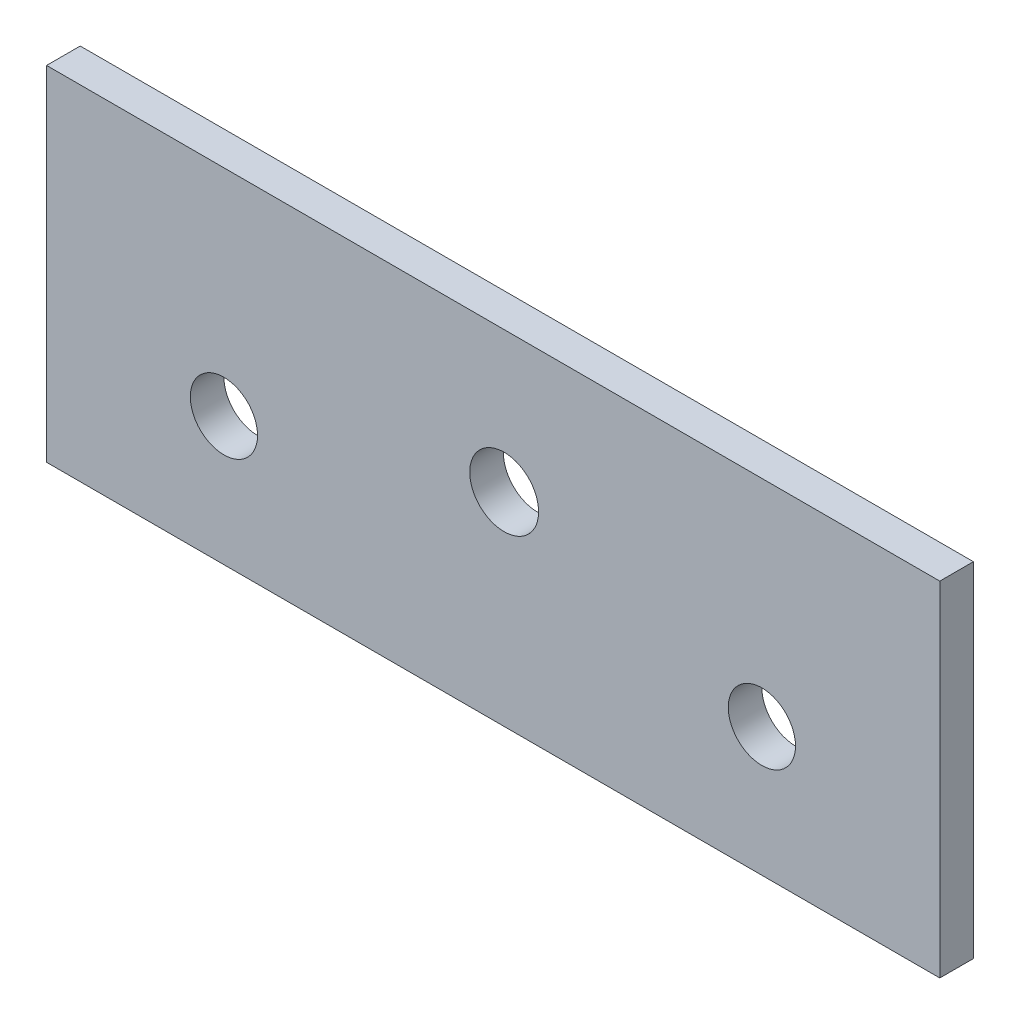
ISO-10303-21;
HEADER;
FILE_DESCRIPTION(('STEP AP214'),'2;1');
FILE_NAME('part.step','',(''),(''),'','','');
FILE_SCHEMA(('AUTOMOTIVE_DESIGN { 1 0 10303 214 1 1 1 1 }'));
ENDSEC;
DATA;
#1=APPLICATION_CONTEXT('core data for automotive mechanical design processes');
#2=APPLICATION_PROTOCOL_DEFINITION('international standard','automotive_design',2000,#1);
#3=PRODUCT_CONTEXT('',#1,'mechanical');
#4=PRODUCT('Part','Part','',(#3));
#5=PRODUCT_RELATED_PRODUCT_CATEGORY('part','',(#4));
#6=PRODUCT_DEFINITION_FORMATION('','',#4);
#7=PRODUCT_DEFINITION_CONTEXT('part definition',#1,'design');
#8=PRODUCT_DEFINITION('design','',#6,#7);
#9=PRODUCT_DEFINITION_SHAPE('','',#8);
#10=(LENGTH_UNIT() NAMED_UNIT(*) SI_UNIT(.MILLI.,.METRE.));
#11=(NAMED_UNIT(*) PLANE_ANGLE_UNIT() SI_UNIT($,.RADIAN.));
#12=(NAMED_UNIT(*) SI_UNIT($,.STERADIAN.) SOLID_ANGLE_UNIT());
#13=UNCERTAINTY_MEASURE_WITH_UNIT(LENGTH_MEASURE(1.E-05),#10,'distance_accuracy_value','');
#14=(GEOMETRIC_REPRESENTATION_CONTEXT(3) GLOBAL_UNCERTAINTY_ASSIGNED_CONTEXT((#13)) GLOBAL_UNIT_ASSIGNED_CONTEXT((#10,
#11,#12)) REPRESENTATION_CONTEXT('',''));
#15=CARTESIAN_POINT('',(0.,0.,0.));
#16=DIRECTION('',(0.,0.,1.));
#17=DIRECTION('',(1.,0.,0.));
#18=AXIS2_PLACEMENT_3D('',#15,#16,#17);
#19=CARTESIAN_POINT('',(0.,0.,3.175));
#20=DIRECTION('',(0.,0.,1.));
#21=DIRECTION('',(1.,0.,0.));
#22=AXIS2_PLACEMENT_3D('',#19,#20,#21);
#23=PLANE('',#22);
#24=CARTESIAN_POINT('',(76.2000000000006,-176.892857142857,3.175));
#25=DIRECTION('',(0.,0.,1.));
#26=DIRECTION('',(1.,0.,0.));
#27=AXIS2_PLACEMENT_3D('',#24,#25,#26);
#28=CIRCLE('',#27,3.17499999999998);
#29=CARTESIAN_POINT('',(79.3750000000006,-176.892857142857,3.175));
#30=VERTEX_POINT('',#29);
#31=EDGE_CURVE('E121',#30,#30,#28,.T.);
#32=ORIENTED_EDGE('',*,*,#31,.F.);
#33=EDGE_LOOP('',(#32));
#34=FACE_BOUND('',#33,.T.);
#35=DIRECTION('',(0.,-1.,0.));
#36=VECTOR('',#35,1.);
#37=CARTESIAN_POINT('',(8.65511732176216,-156.589142015321,3.175));
#38=LINE('',#37,#36);
#39=CARTESIAN_POINT('',(8.65511732176216,-156.589142015321,3.175));
#40=VERTEX_POINT('',#39);
#41=CARTESIAN_POINT('',(8.65511732176216,-189.047286789418,3.175));
#42=VERTEX_POINT('',#41);
#43=EDGE_CURVE('E91',#40,#42,#38,.T.);
#44=ORIENTED_EDGE('',*,*,#43,.T.);
#45=DIRECTION('',(1.,0.,0.));
#46=VECTOR('',#45,1.);
#47=CARTESIAN_POINT('',(8.65511732176216,-189.047286789418,3.175));
#48=LINE('',#47,#46);
#49=CARTESIAN_POINT('',(92.999147290957,-189.047286789418,3.175));
#50=VERTEX_POINT('',#49);
#51=EDGE_CURVE('E86',#42,#50,#48,.T.);
#52=ORIENTED_EDGE('',*,*,#51,.T.);
#53=DIRECTION('',(0.,1.,0.));
#54=VECTOR('',#53,1.);
#55=CARTESIAN_POINT('',(92.999147290957,-156.589142015321,3.175));
#56=LINE('',#55,#54);
#57=CARTESIAN_POINT('',(92.999147290957,-156.589142015321,3.175));
#58=VERTEX_POINT('',#57);
#59=EDGE_CURVE('E89',#50,#58,#56,.T.);
#60=ORIENTED_EDGE('',*,*,#59,.T.);
#61=DIRECTION('',(-1.,0.,0.));
#62=VECTOR('',#61,1.);
#63=CARTESIAN_POINT('',(8.65511732176216,-156.589142015321,3.175));
#64=LINE('',#63,#62);
#65=EDGE_CURVE('E56',#58,#40,#64,.T.);
#66=ORIENTED_EDGE('',*,*,#65,.T.);
#67=EDGE_LOOP('',(#44,#52,#60,#66));
#68=FACE_BOUND('',#67,.T.);
#69=CARTESIAN_POINT('',(25.4000000000006,-176.892857142857,3.175));
#70=DIRECTION('',(0.,0.,1.));
#71=DIRECTION('',(1.,0.,0.));
#72=AXIS2_PLACEMENT_3D('',#69,#70,#71);
#73=CIRCLE('',#72,3.17500000000001);
#74=CARTESIAN_POINT('',(28.5750000000006,-176.892857142857,3.175));
#75=VERTEX_POINT('',#74);
#76=EDGE_CURVE('E106',#75,#75,#73,.T.);
#77=ORIENTED_EDGE('',*,*,#76,.F.);
#78=EDGE_LOOP('',(#77));
#79=FACE_BOUND('',#78,.T.);
#80=CARTESIAN_POINT('',(51.8620466073178,-169.868155983452,3.175));
#81=DIRECTION('',(0.,0.,1.));
#82=DIRECTION('',(1.,0.,0.));
#83=AXIS2_PLACEMENT_3D('',#80,#81,#82);
#84=CIRCLE('',#83,3.2512);
#85=CARTESIAN_POINT('',(55.1132466073178,-169.868155983452,3.175));
#86=VERTEX_POINT('',#85);
#87=EDGE_CURVE('E127',#86,#86,#84,.T.);
#88=ORIENTED_EDGE('',*,*,#87,.F.);
#89=EDGE_LOOP('',(#88));
#90=FACE_BOUND('',#89,.T.);
#91=ADVANCED_FACE('F39',(#34,#68,#79,#90),#23,.T.);
#92=CARTESIAN_POINT('',(0.,0.,0.));
#93=DIRECTION('',(0.,0.,1.));
#94=DIRECTION('',(1.,0.,0.));
#95=AXIS2_PLACEMENT_3D('',#92,#93,#94);
#96=PLANE('',#95);
#97=DIRECTION('',(0.,-1.,0.));
#98=VECTOR('',#97,1.);
#99=CARTESIAN_POINT('',(8.65511732176216,-156.589142015321,0.));
#100=LINE('',#99,#98);
#101=CARTESIAN_POINT('',(8.65511732176216,-156.589142015321,0.));
#102=VERTEX_POINT('',#101);
#103=CARTESIAN_POINT('',(8.65511732176216,-189.047286789418,0.));
#104=VERTEX_POINT('',#103);
#105=EDGE_CURVE('E103',#102,#104,#100,.T.);
#106=ORIENTED_EDGE('',*,*,#105,.F.);
#107=DIRECTION('',(-1.,0.,0.));
#108=VECTOR('',#107,1.);
#109=CARTESIAN_POINT('',(8.65511732176216,-156.589142015321,0.));
#110=LINE('',#109,#108);
#111=CARTESIAN_POINT('',(92.999147290957,-156.589142015321,0.));
#112=VERTEX_POINT('',#111);
#113=EDGE_CURVE('E79',#112,#102,#110,.T.);
#114=ORIENTED_EDGE('',*,*,#113,.F.);
#115=DIRECTION('',(0.,1.,0.));
#116=VECTOR('',#115,1.);
#117=CARTESIAN_POINT('',(92.999147290957,-156.589142015321,0.));
#118=LINE('',#117,#116);
#119=CARTESIAN_POINT('',(92.999147290957,-189.047286789418,0.));
#120=VERTEX_POINT('',#119);
#121=EDGE_CURVE('E73',#120,#112,#118,.T.);
#122=ORIENTED_EDGE('',*,*,#121,.F.);
#123=DIRECTION('',(1.,0.,0.));
#124=VECTOR('',#123,1.);
#125=CARTESIAN_POINT('',(8.65511732176216,-189.047286789418,0.));
#126=LINE('',#125,#124);
#127=EDGE_CURVE('E95',#104,#120,#126,.T.);
#128=ORIENTED_EDGE('',*,*,#127,.F.);
#129=EDGE_LOOP('',(#106,#114,#122,#128));
#130=FACE_BOUND('',#129,.T.);
#131=CARTESIAN_POINT('',(25.4000000000006,-176.892857142857,0.));
#132=DIRECTION('',(0.,0.,1.));
#133=DIRECTION('',(1.,0.,0.));
#134=AXIS2_PLACEMENT_3D('',#131,#132,#133);
#135=CIRCLE('',#134,3.17500000000001);
#136=CARTESIAN_POINT('',(28.5750000000006,-176.892857142857,0.));
#137=VERTEX_POINT('',#136);
#138=EDGE_CURVE('E118',#137,#137,#135,.T.);
#139=ORIENTED_EDGE('',*,*,#138,.T.);
#140=EDGE_LOOP('',(#139));
#141=FACE_BOUND('',#140,.T.);
#142=CARTESIAN_POINT('',(76.2000000000006,-176.892857142857,0.));
#143=DIRECTION('',(0.,0.,1.));
#144=DIRECTION('',(1.,0.,0.));
#145=AXIS2_PLACEMENT_3D('',#142,#143,#144);
#146=CIRCLE('',#145,3.17499999999998);
#147=CARTESIAN_POINT('',(79.3750000000006,-176.892857142857,0.));
#148=VERTEX_POINT('',#147);
#149=EDGE_CURVE('E124',#148,#148,#146,.T.);
#150=ORIENTED_EDGE('',*,*,#149,.T.);
#151=EDGE_LOOP('',(#150));
#152=FACE_BOUND('',#151,.T.);
#153=CARTESIAN_POINT('',(51.8620466073178,-169.868155983452,0.));
#154=DIRECTION('',(0.,0.,1.));
#155=DIRECTION('',(1.,0.,0.));
#156=AXIS2_PLACEMENT_3D('',#153,#154,#155);
#157=CIRCLE('',#156,3.2512);
#158=CARTESIAN_POINT('',(55.1132466073178,-169.868155983452,0.));
#159=VERTEX_POINT('',#158);
#160=EDGE_CURVE('E130',#159,#159,#157,.T.);
#161=ORIENTED_EDGE('',*,*,#160,.T.);
#162=EDGE_LOOP('',(#161));
#163=FACE_BOUND('',#162,.T.);
#164=ADVANCED_FACE('F114',(#130,#141,#152,#163),#96,.F.);
#165=CARTESIAN_POINT('',(8.65511732176216,-156.589142015321,3.175));
#166=DIRECTION('',(1.,0.,0.));
#167=DIRECTION('',(0.,0.,-1.));
#168=AXIS2_PLACEMENT_3D('',#165,#166,#167);
#169=PLANE('',#168);
#170=ORIENTED_EDGE('',*,*,#105,.T.);
#171=DIRECTION('',(0.,0.,-1.));
#172=VECTOR('',#171,1.);
#173=CARTESIAN_POINT('',(8.65511732176216,-189.047286789418,3.175));
#174=LINE('',#173,#172);
#175=EDGE_CURVE('E11',#42,#104,#174,.T.);
#176=ORIENTED_EDGE('',*,*,#175,.F.);
#177=ORIENTED_EDGE('',*,*,#43,.F.);
#178=DIRECTION('',(0.,0.,-1.));
#179=VECTOR('',#178,1.);
#180=CARTESIAN_POINT('',(8.65511732176216,-156.589142015321,3.175));
#181=LINE('',#180,#179);
#182=EDGE_CURVE('E99',#40,#102,#181,.T.);
#183=ORIENTED_EDGE('',*,*,#182,.T.);
#184=EDGE_LOOP('',(#170,#176,#177,#183));
#185=FACE_BOUND('',#184,.T.);
#186=ADVANCED_FACE('F41',(#185),#169,.F.);
#187=CARTESIAN_POINT('',(8.65511732176216,-189.047286789418,3.175));
#188=DIRECTION('',(0.,1.,0.));
#189=DIRECTION('',(0.,0.,1.));
#190=AXIS2_PLACEMENT_3D('',#187,#188,#189);
#191=PLANE('',#190);
#192=ORIENTED_EDGE('',*,*,#127,.T.);
#193=DIRECTION('',(0.,0.,-1.));
#194=VECTOR('',#193,1.);
#195=CARTESIAN_POINT('',(92.999147290957,-189.047286789418,3.175));
#196=LINE('',#195,#194);
#197=EDGE_CURVE('E48',#50,#120,#196,.T.);
#198=ORIENTED_EDGE('',*,*,#197,.F.);
#199=ORIENTED_EDGE('',*,*,#51,.F.);
#200=ORIENTED_EDGE('',*,*,#175,.T.);
#201=EDGE_LOOP('',(#192,#198,#199,#200));
#202=FACE_BOUND('',#201,.T.);
#203=ADVANCED_FACE('F94',(#202),#191,.F.);
#204=CARTESIAN_POINT('',(92.999147290957,-156.589142015321,3.175));
#205=DIRECTION('',(-1.,0.,0.));
#206=DIRECTION('',(0.,0.,1.));
#207=AXIS2_PLACEMENT_3D('',#204,#205,#206);
#208=PLANE('',#207);
#209=ORIENTED_EDGE('',*,*,#121,.T.);
#210=DIRECTION('',(0.,0.,-1.));
#211=VECTOR('',#210,1.);
#212=CARTESIAN_POINT('',(92.999147290957,-156.589142015321,3.175));
#213=LINE('',#212,#211);
#214=EDGE_CURVE('E96',#58,#112,#213,.T.);
#215=ORIENTED_EDGE('',*,*,#214,.F.);
#216=ORIENTED_EDGE('',*,*,#59,.F.);
#217=ORIENTED_EDGE('',*,*,#197,.T.);
#218=EDGE_LOOP('',(#209,#215,#216,#217));
#219=FACE_BOUND('',#218,.T.);
#220=ADVANCED_FACE('F97',(#219),#208,.F.);
#221=CARTESIAN_POINT('',(8.65511732176216,-156.589142015321,3.175));
#222=DIRECTION('',(0.,-1.,0.));
#223=DIRECTION('',(0.,0.,-1.));
#224=AXIS2_PLACEMENT_3D('',#221,#222,#223);
#225=PLANE('',#224);
#226=ORIENTED_EDGE('',*,*,#113,.T.);
#227=ORIENTED_EDGE('',*,*,#182,.F.);
#228=ORIENTED_EDGE('',*,*,#65,.F.);
#229=ORIENTED_EDGE('',*,*,#214,.T.);
#230=EDGE_LOOP('',(#226,#227,#228,#229));
#231=FACE_BOUND('',#230,.T.);
#232=ADVANCED_FACE('F111',(#231),#225,.F.);
#233=CARTESIAN_POINT('',(25.4000000000006,-176.892857142857,3.175));
#234=DIRECTION('',(0.,0.,-1.));
#235=DIRECTION('',(-1.,0.,0.));
#236=AXIS2_PLACEMENT_3D('',#233,#234,#235);
#237=CYLINDRICAL_SURFACE('',#236,3.17500000000001);
#238=ORIENTED_EDGE('',*,*,#76,.T.);
#239=EDGE_LOOP('',(#238));
#240=FACE_BOUND('',#239,.T.);
#241=ORIENTED_EDGE('',*,*,#138,.F.);
#242=EDGE_LOOP('',(#241));
#243=FACE_BOUND('',#242,.T.);
#244=ADVANCED_FACE('F148',(#240,#243),#237,.F.);
#245=CARTESIAN_POINT('',(76.2000000000006,-176.892857142857,3.175));
#246=DIRECTION('',(0.,0.,-1.));
#247=DIRECTION('',(-1.,0.,0.));
#248=AXIS2_PLACEMENT_3D('',#245,#246,#247);
#249=CYLINDRICAL_SURFACE('',#248,3.17499999999998);
#250=ORIENTED_EDGE('',*,*,#31,.T.);
#251=EDGE_LOOP('',(#250));
#252=FACE_BOUND('',#251,.T.);
#253=ORIENTED_EDGE('',*,*,#149,.F.);
#254=EDGE_LOOP('',(#253));
#255=FACE_BOUND('',#254,.T.);
#256=ADVANCED_FACE('F193',(#252,#255),#249,.F.);
#257=CARTESIAN_POINT('',(51.8620466073178,-169.868155983452,3.175));
#258=DIRECTION('',(0.,0.,-1.));
#259=DIRECTION('',(-1.,0.,0.));
#260=AXIS2_PLACEMENT_3D('',#257,#258,#259);
#261=CYLINDRICAL_SURFACE('',#260,3.2512);
#262=ORIENTED_EDGE('',*,*,#87,.T.);
#263=EDGE_LOOP('',(#262));
#264=FACE_BOUND('',#263,.T.);
#265=ORIENTED_EDGE('',*,*,#160,.F.);
#266=EDGE_LOOP('',(#265));
#267=FACE_BOUND('',#266,.T.);
#268=ADVANCED_FACE('F136',(#264,#267),#261,.F.);
#269=CLOSED_SHELL('',(#91,#164,#186,#203,#220,#232,#244,#256,#268));
#270=MANIFOLD_SOLID_BREP('B2',#269);
#271=ADVANCED_BREP_SHAPE_REPRESENTATION('',(#18,#270),#14);
#272=SHAPE_DEFINITION_REPRESENTATION(#9,#271);
ENDSEC;
END-ISO-10303-21;
